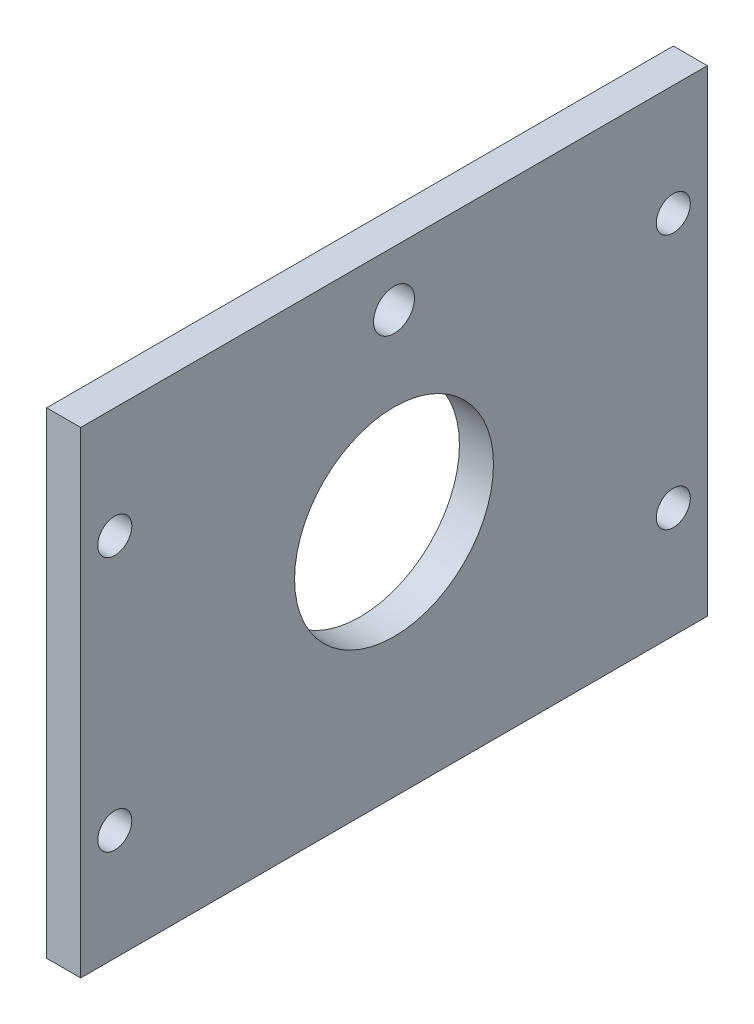
ISO-10303-21;
HEADER;
FILE_DESCRIPTION(('STEP AP214'),'2;1');
FILE_NAME('part.step','',(''),(''),'','','');
FILE_SCHEMA(('AUTOMOTIVE_DESIGN { 1 0 10303 214 1 1 1 1 }'));
ENDSEC;
DATA;
#1=APPLICATION_CONTEXT('core data for automotive mechanical design processes');
#2=APPLICATION_PROTOCOL_DEFINITION('international standard','automotive_design',2000,#1);
#3=PRODUCT_CONTEXT('',#1,'mechanical');
#4=PRODUCT('Part','Part','',(#3));
#5=PRODUCT_RELATED_PRODUCT_CATEGORY('part','',(#4));
#6=PRODUCT_DEFINITION_FORMATION('','',#4);
#7=PRODUCT_DEFINITION_CONTEXT('part definition',#1,'design');
#8=PRODUCT_DEFINITION('design','',#6,#7);
#9=PRODUCT_DEFINITION_SHAPE('','',#8);
#10=(LENGTH_UNIT() NAMED_UNIT(*) SI_UNIT(.MILLI.,.METRE.));
#11=(NAMED_UNIT(*) PLANE_ANGLE_UNIT() SI_UNIT($,.RADIAN.));
#12=(NAMED_UNIT(*) SI_UNIT($,.STERADIAN.) SOLID_ANGLE_UNIT());
#13=UNCERTAINTY_MEASURE_WITH_UNIT(LENGTH_MEASURE(1.E-05),#10,'distance_accuracy_value','');
#14=(GEOMETRIC_REPRESENTATION_CONTEXT(3) GLOBAL_UNCERTAINTY_ASSIGNED_CONTEXT((#13)) GLOBAL_UNIT_ASSIGNED_CONTEXT((#10,
#11,#12)) REPRESENTATION_CONTEXT('',''));
#15=CARTESIAN_POINT('',(0.,0.,0.));
#16=DIRECTION('',(0.,0.,1.));
#17=DIRECTION('',(1.,0.,0.));
#18=AXIS2_PLACEMENT_3D('',#15,#16,#17);
#19=CARTESIAN_POINT('',(5.,0.,0.));
#20=DIRECTION('',(1.,0.,0.));
#21=DIRECTION('',(0.,0.,-1.));
#22=AXIS2_PLACEMENT_3D('',#19,#20,#21);
#23=PLANE('',#22);
#24=CARTESIAN_POINT('',(5.,-8.05947805704662,-45.9999999999998));
#25=DIRECTION('',(-1.,0.,0.));
#26=DIRECTION('',(0.,0.,1.));
#27=AXIS2_PLACEMENT_3D('',#24,#25,#26);
#28=CIRCLE('',#27,3.);
#29=CARTESIAN_POINT('',(5.,-8.05947805704662,-42.9999999999998));
#30=VERTEX_POINT('',#29);
#31=EDGE_CURVE('E143',#30,#30,#28,.T.);
#32=ORIENTED_EDGE('',*,*,#31,.T.);
#33=EDGE_LOOP('',(#32));
#34=FACE_BOUND('',#33,.T.);
#35=CARTESIAN_POINT('',(5.,-16.2724458586385,-4.99999999999979));
#36=DIRECTION('',(1.,0.,0.));
#37=DIRECTION('',(0.,0.,-1.));
#38=AXIS2_PLACEMENT_3D('',#35,#36,#37);
#39=CIRCLE('',#38,2.5);
#40=CARTESIAN_POINT('',(5.,-16.2724458586385,-7.49999999999979));
#41=VERTEX_POINT('',#40);
#42=EDGE_CURVE('E125',#41,#41,#39,.T.);
#43=ORIENTED_EDGE('',*,*,#42,.F.);
#44=EDGE_LOOP('',(#43));
#45=FACE_BOUND('',#44,.T.);
#46=CARTESIAN_POINT('',(5.,-53.7275541413603,-86.9999999999995));
#47=DIRECTION('',(1.,0.,0.));
#48=DIRECTION('',(0.,0.,-1.));
#49=AXIS2_PLACEMENT_3D('',#46,#47,#48);
#50=CIRCLE('',#49,2.5);
#51=CARTESIAN_POINT('',(5.,-53.7275541413603,-89.4999999999995));
#52=VERTEX_POINT('',#51);
#53=EDGE_CURVE('E128',#52,#52,#50,.T.);
#54=ORIENTED_EDGE('',*,*,#53,.F.);
#55=EDGE_LOOP('',(#54));
#56=FACE_BOUND('',#55,.T.);
#57=CARTESIAN_POINT('',(5.,-16.2724458586391,-86.9999999999998));
#58=DIRECTION('',(1.,0.,0.));
#59=DIRECTION('',(0.,0.,-1.));
#60=AXIS2_PLACEMENT_3D('',#57,#58,#59);
#61=CIRCLE('',#60,2.50000000000001);
#62=CARTESIAN_POINT('',(5.,-16.2724458586391,-89.4999999999998));
#63=VERTEX_POINT('',#62);
#64=EDGE_CURVE('E131',#63,#63,#61,.T.);
#65=ORIENTED_EDGE('',*,*,#64,.F.);
#66=EDGE_LOOP('',(#65));
#67=FACE_BOUND('',#66,.T.);
#68=CARTESIAN_POINT('',(5.,-53.7275541413597,-4.99999999999953));
#69=DIRECTION('',(1.,0.,0.));
#70=DIRECTION('',(0.,0.,-1.));
#71=AXIS2_PLACEMENT_3D('',#68,#69,#70);
#72=CIRCLE('',#71,2.5);
#73=CARTESIAN_POINT('',(5.,-53.7275541413597,-7.49999999999953));
#74=VERTEX_POINT('',#73);
#75=EDGE_CURVE('E117',#74,#74,#72,.T.);
#76=ORIENTED_EDGE('',*,*,#75,.F.);
#77=EDGE_LOOP('',(#76));
#78=FACE_BOUND('',#77,.T.);
#79=DIRECTION('',(0.,-1.,0.));
#80=VECTOR('',#79,1.);
#81=CARTESIAN_POINT('',(5.,0.,0.));
#82=LINE('',#81,#80);
#83=CARTESIAN_POINT('',(5.,0.,0.));
#84=VERTEX_POINT('',#83);
#85=CARTESIAN_POINT('',(5.,-70.,0.));
#86=VERTEX_POINT('',#85);
#87=EDGE_CURVE('E86',#84,#86,#82,.T.);
#88=ORIENTED_EDGE('',*,*,#87,.T.);
#89=DIRECTION('',(0.,0.,-1.));
#90=VECTOR('',#89,1.);
#91=CARTESIAN_POINT('',(5.,-70.,0.));
#92=LINE('',#91,#90);
#93=CARTESIAN_POINT('',(5.,-70.,-92.));
#94=VERTEX_POINT('',#93);
#95=EDGE_CURVE('E81',#86,#94,#92,.T.);
#96=ORIENTED_EDGE('',*,*,#95,.T.);
#97=DIRECTION('',(0.,1.,0.));
#98=VECTOR('',#97,1.);
#99=CARTESIAN_POINT('',(5.,0.,-92.));
#100=LINE('',#99,#98);
#101=CARTESIAN_POINT('',(5.,0.,-92.));
#102=VERTEX_POINT('',#101);
#103=EDGE_CURVE('E84',#94,#102,#100,.T.);
#104=ORIENTED_EDGE('',*,*,#103,.T.);
#105=DIRECTION('',(0.,0.,1.));
#106=VECTOR('',#105,1.);
#107=CARTESIAN_POINT('',(5.,0.,0.));
#108=LINE('',#107,#106);
#109=EDGE_CURVE('E51',#102,#84,#108,.T.);
#110=ORIENTED_EDGE('',*,*,#109,.T.);
#111=EDGE_LOOP('',(#88,#96,#104,#110));
#112=FACE_BOUND('',#111,.T.);
#113=CARTESIAN_POINT('',(5.,-35.,-46.));
#114=DIRECTION('',(1.,0.,0.));
#115=DIRECTION('',(0.,0.,-1.));
#116=AXIS2_PLACEMENT_3D('',#113,#114,#115);
#117=CIRCLE('',#116,14.6);
#118=CARTESIAN_POINT('',(5.,-35.,-60.6));
#119=VERTEX_POINT('',#118);
#120=EDGE_CURVE('E102',#119,#119,#117,.T.);
#121=ORIENTED_EDGE('',*,*,#120,.F.);
#122=EDGE_LOOP('',(#121));
#123=FACE_BOUND('',#122,.T.);
#124=ADVANCED_FACE('F33',(#34,#45,#56,#67,#78,#112,#123),#23,.T.);
#125=CARTESIAN_POINT('',(0.,0.,0.));
#126=DIRECTION('',(1.,0.,0.));
#127=DIRECTION('',(0.,0.,-1.));
#128=AXIS2_PLACEMENT_3D('',#125,#126,#127);
#129=PLANE('',#128);
#130=CARTESIAN_POINT('',(0.,-8.05947805704662,-45.9999999999998));
#131=DIRECTION('',(1.,0.,0.));
#132=DIRECTION('',(0.,0.,-1.));
#133=AXIS2_PLACEMENT_3D('',#130,#131,#132);
#134=CIRCLE('',#133,3.);
#135=CARTESIAN_POINT('',(0.,-8.05947805704662,-48.9999999999999));
#136=VERTEX_POINT('',#135);
#137=EDGE_CURVE('E37',#136,#136,#134,.T.);
#138=ORIENTED_EDGE('',*,*,#137,.T.);
#139=EDGE_LOOP('',(#138));
#140=FACE_BOUND('',#139,.T.);
#141=CARTESIAN_POINT('',(0.,-16.2724458586385,-4.99999999999979));
#142=DIRECTION('',(1.,0.,0.));
#143=DIRECTION('',(0.,0.,-1.));
#144=AXIS2_PLACEMENT_3D('',#141,#142,#143);
#145=CIRCLE('',#144,2.5);
#146=CARTESIAN_POINT('',(0.,-16.2724458586385,-7.49999999999979));
#147=VERTEX_POINT('',#146);
#148=EDGE_CURVE('E134',#147,#147,#145,.T.);
#149=ORIENTED_EDGE('',*,*,#148,.T.);
#150=EDGE_LOOP('',(#149));
#151=FACE_BOUND('',#150,.T.);
#152=CARTESIAN_POINT('',(0.,-53.7275541413603,-86.9999999999995));
#153=DIRECTION('',(1.,0.,0.));
#154=DIRECTION('',(0.,0.,-1.));
#155=AXIS2_PLACEMENT_3D('',#152,#153,#154);
#156=CIRCLE('',#155,2.5);
#157=CARTESIAN_POINT('',(0.,-53.7275541413603,-89.4999999999995));
#158=VERTEX_POINT('',#157);
#159=EDGE_CURVE('E138',#158,#158,#156,.T.);
#160=ORIENTED_EDGE('',*,*,#159,.T.);
#161=EDGE_LOOP('',(#160));
#162=FACE_BOUND('',#161,.T.);
#163=CARTESIAN_POINT('',(0.,-16.2724458586391,-86.9999999999998));
#164=DIRECTION('',(1.,0.,0.));
#165=DIRECTION('',(0.,0.,-1.));
#166=AXIS2_PLACEMENT_3D('',#163,#164,#165);
#167=CIRCLE('',#166,2.50000000000001);
#168=CARTESIAN_POINT('',(0.,-16.2724458586391,-89.4999999999998));
#169=VERTEX_POINT('',#168);
#170=EDGE_CURVE('E135',#169,#169,#167,.T.);
#171=ORIENTED_EDGE('',*,*,#170,.T.);
#172=EDGE_LOOP('',(#171));
#173=FACE_BOUND('',#172,.T.);
#174=CARTESIAN_POINT('',(0.,-53.7275541413597,-4.99999999999953));
#175=DIRECTION('',(1.,0.,0.));
#176=DIRECTION('',(0.,0.,-1.));
#177=AXIS2_PLACEMENT_3D('',#174,#175,#176);
#178=CIRCLE('',#177,2.5);
#179=CARTESIAN_POINT('',(0.,-53.7275541413597,-7.49999999999953));
#180=VERTEX_POINT('',#179);
#181=EDGE_CURVE('E122',#180,#180,#178,.T.);
#182=ORIENTED_EDGE('',*,*,#181,.T.);
#183=EDGE_LOOP('',(#182));
#184=FACE_BOUND('',#183,.T.);
#185=DIRECTION('',(0.,-1.,0.));
#186=VECTOR('',#185,1.);
#187=CARTESIAN_POINT('',(0.,0.,0.));
#188=LINE('',#187,#186);
#189=CARTESIAN_POINT('',(0.,0.,0.));
#190=VERTEX_POINT('',#189);
#191=CARTESIAN_POINT('',(0.,-70.,0.));
#192=VERTEX_POINT('',#191);
#193=EDGE_CURVE('E99',#190,#192,#188,.T.);
#194=ORIENTED_EDGE('',*,*,#193,.F.);
#195=DIRECTION('',(0.,0.,1.));
#196=VECTOR('',#195,1.);
#197=CARTESIAN_POINT('',(0.,0.,0.));
#198=LINE('',#197,#196);
#199=CARTESIAN_POINT('',(0.,0.,-92.));
#200=VERTEX_POINT('',#199);
#201=EDGE_CURVE('E74',#200,#190,#198,.T.);
#202=ORIENTED_EDGE('',*,*,#201,.F.);
#203=DIRECTION('',(0.,1.,0.));
#204=VECTOR('',#203,1.);
#205=CARTESIAN_POINT('',(0.,0.,-92.));
#206=LINE('',#205,#204);
#207=CARTESIAN_POINT('',(0.,-70.,-92.));
#208=VERTEX_POINT('',#207);
#209=EDGE_CURVE('E68',#208,#200,#206,.T.);
#210=ORIENTED_EDGE('',*,*,#209,.F.);
#211=DIRECTION('',(0.,0.,-1.));
#212=VECTOR('',#211,1.);
#213=CARTESIAN_POINT('',(0.,-70.,0.));
#214=LINE('',#213,#212);
#215=EDGE_CURVE('E90',#192,#208,#214,.T.);
#216=ORIENTED_EDGE('',*,*,#215,.F.);
#217=EDGE_LOOP('',(#194,#202,#210,#216));
#218=FACE_BOUND('',#217,.T.);
#219=CARTESIAN_POINT('',(0.,-35.,-46.));
#220=DIRECTION('',(1.,0.,0.));
#221=DIRECTION('',(0.,0.,-1.));
#222=AXIS2_PLACEMENT_3D('',#219,#220,#221);
#223=CIRCLE('',#222,14.6);
#224=CARTESIAN_POINT('',(0.,-35.,-60.6));
#225=VERTEX_POINT('',#224);
#226=EDGE_CURVE('E114',#225,#225,#223,.T.);
#227=ORIENTED_EDGE('',*,*,#226,.T.);
#228=EDGE_LOOP('',(#227));
#229=FACE_BOUND('',#228,.T.);
#230=ADVANCED_FACE('F110',(#140,#151,#162,#173,#184,#218,#229),#129,.F.);
#231=CARTESIAN_POINT('',(5.,0.,0.));
#232=DIRECTION('',(0.,0.,-1.));
#233=DIRECTION('',(0.,1.,0.));
#234=AXIS2_PLACEMENT_3D('',#231,#232,#233);
#235=PLANE('',#234);
#236=ORIENTED_EDGE('',*,*,#193,.T.);
#237=DIRECTION('',(-1.,0.,0.));
#238=VECTOR('',#237,1.);
#239=CARTESIAN_POINT('',(5.,-70.,0.));
#240=LINE('',#239,#238);
#241=EDGE_CURVE('E11',#86,#192,#240,.T.);
#242=ORIENTED_EDGE('',*,*,#241,.F.);
#243=ORIENTED_EDGE('',*,*,#87,.F.);
#244=DIRECTION('',(-1.,0.,0.));
#245=VECTOR('',#244,1.);
#246=CARTESIAN_POINT('',(5.,0.,0.));
#247=LINE('',#246,#245);
#248=EDGE_CURVE('E95',#84,#190,#247,.T.);
#249=ORIENTED_EDGE('',*,*,#248,.T.);
#250=EDGE_LOOP('',(#236,#242,#243,#249));
#251=FACE_BOUND('',#250,.T.);
#252=ADVANCED_FACE('F35',(#251),#235,.F.);
#253=CARTESIAN_POINT('',(5.,-70.,0.));
#254=DIRECTION('',(0.,1.,0.));
#255=DIRECTION('',(0.,0.,1.));
#256=AXIS2_PLACEMENT_3D('',#253,#254,#255);
#257=PLANE('',#256);
#258=ORIENTED_EDGE('',*,*,#215,.T.);
#259=DIRECTION('',(-1.,0.,0.));
#260=VECTOR('',#259,1.);
#261=CARTESIAN_POINT('',(5.,-70.,-92.));
#262=LINE('',#261,#260);
#263=EDGE_CURVE('E43',#94,#208,#262,.T.);
#264=ORIENTED_EDGE('',*,*,#263,.F.);
#265=ORIENTED_EDGE('',*,*,#95,.F.);
#266=ORIENTED_EDGE('',*,*,#241,.T.);
#267=EDGE_LOOP('',(#258,#264,#265,#266));
#268=FACE_BOUND('',#267,.T.);
#269=ADVANCED_FACE('F89',(#268),#257,.F.);
#270=CARTESIAN_POINT('',(5.,0.,-92.));
#271=DIRECTION('',(0.,0.,1.));
#272=DIRECTION('',(0.,-1.,0.));
#273=AXIS2_PLACEMENT_3D('',#270,#271,#272);
#274=PLANE('',#273);
#275=ORIENTED_EDGE('',*,*,#209,.T.);
#276=DIRECTION('',(-1.,0.,0.));
#277=VECTOR('',#276,1.);
#278=CARTESIAN_POINT('',(5.,0.,-92.));
#279=LINE('',#278,#277);
#280=EDGE_CURVE('E91',#102,#200,#279,.T.);
#281=ORIENTED_EDGE('',*,*,#280,.F.);
#282=ORIENTED_EDGE('',*,*,#103,.F.);
#283=ORIENTED_EDGE('',*,*,#263,.T.);
#284=EDGE_LOOP('',(#275,#281,#282,#283));
#285=FACE_BOUND('',#284,.T.);
#286=ADVANCED_FACE('F93',(#285),#274,.F.);
#287=CARTESIAN_POINT('',(5.,0.,0.));
#288=DIRECTION('',(0.,-1.,0.));
#289=DIRECTION('',(0.,0.,-1.));
#290=AXIS2_PLACEMENT_3D('',#287,#288,#289);
#291=PLANE('',#290);
#292=ORIENTED_EDGE('',*,*,#201,.T.);
#293=ORIENTED_EDGE('',*,*,#248,.F.);
#294=ORIENTED_EDGE('',*,*,#109,.F.);
#295=ORIENTED_EDGE('',*,*,#280,.T.);
#296=EDGE_LOOP('',(#292,#293,#294,#295));
#297=FACE_BOUND('',#296,.T.);
#298=ADVANCED_FACE('F107',(#297),#291,.F.);
#299=CARTESIAN_POINT('',(5.,-35.,-46.));
#300=DIRECTION('',(-1.,0.,0.));
#301=DIRECTION('',(0.,0.,1.));
#302=AXIS2_PLACEMENT_3D('',#299,#300,#301);
#303=CYLINDRICAL_SURFACE('',#302,14.6);
#304=ORIENTED_EDGE('',*,*,#120,.T.);
#305=EDGE_LOOP('',(#304));
#306=FACE_BOUND('',#305,.T.);
#307=ORIENTED_EDGE('',*,*,#226,.F.);
#308=EDGE_LOOP('',(#307));
#309=FACE_BOUND('',#308,.T.);
#310=ADVANCED_FACE('F172',(#306,#309),#303,.F.);
#311=CARTESIAN_POINT('',(0.,-53.7275541413597,-4.99999999999953));
#312=DIRECTION('',(1.,0.,0.));
#313=DIRECTION('',(0.,0.,-1.));
#314=AXIS2_PLACEMENT_3D('',#311,#312,#313);
#315=CYLINDRICAL_SURFACE('',#314,2.5);
#316=ORIENTED_EDGE('',*,*,#75,.T.);
#317=EDGE_LOOP('',(#316));
#318=FACE_BOUND('',#317,.T.);
#319=ORIENTED_EDGE('',*,*,#181,.F.);
#320=EDGE_LOOP('',(#319));
#321=FACE_BOUND('',#320,.T.);
#322=ADVANCED_FACE('F219',(#318,#321),#315,.F.);
#323=CARTESIAN_POINT('',(0.,-16.2724458586391,-86.9999999999998));
#324=DIRECTION('',(1.,0.,0.));
#325=DIRECTION('',(0.,0.,-1.));
#326=AXIS2_PLACEMENT_3D('',#323,#324,#325);
#327=CYLINDRICAL_SURFACE('',#326,2.50000000000001);
#328=ORIENTED_EDGE('',*,*,#64,.T.);
#329=EDGE_LOOP('',(#328));
#330=FACE_BOUND('',#329,.T.);
#331=ORIENTED_EDGE('',*,*,#170,.F.);
#332=EDGE_LOOP('',(#331));
#333=FACE_BOUND('',#332,.T.);
#334=ADVANCED_FACE('F210',(#330,#333),#327,.F.);
#335=CARTESIAN_POINT('',(0.,-53.7275541413603,-86.9999999999995));
#336=DIRECTION('',(1.,0.,0.));
#337=DIRECTION('',(0.,0.,-1.));
#338=AXIS2_PLACEMENT_3D('',#335,#336,#337);
#339=CYLINDRICAL_SURFACE('',#338,2.5);
#340=ORIENTED_EDGE('',*,*,#53,.T.);
#341=EDGE_LOOP('',(#340));
#342=FACE_BOUND('',#341,.T.);
#343=ORIENTED_EDGE('',*,*,#159,.F.);
#344=EDGE_LOOP('',(#343));
#345=FACE_BOUND('',#344,.T.);
#346=ADVANCED_FACE('F160',(#342,#345),#339,.F.);
#347=CARTESIAN_POINT('',(0.,-16.2724458586385,-4.99999999999979));
#348=DIRECTION('',(1.,0.,0.));
#349=DIRECTION('',(0.,0.,-1.));
#350=AXIS2_PLACEMENT_3D('',#347,#348,#349);
#351=CYLINDRICAL_SURFACE('',#350,2.5);
#352=ORIENTED_EDGE('',*,*,#42,.T.);
#353=EDGE_LOOP('',(#352));
#354=FACE_BOUND('',#353,.T.);
#355=ORIENTED_EDGE('',*,*,#148,.F.);
#356=EDGE_LOOP('',(#355));
#357=FACE_BOUND('',#356,.T.);
#358=ADVANCED_FACE('F154',(#354,#357),#351,.F.);
#359=CARTESIAN_POINT('',(5.,-8.05947805704662,-45.9999999999998));
#360=DIRECTION('',(-1.,0.,0.));
#361=DIRECTION('',(0.,0.,1.));
#362=AXIS2_PLACEMENT_3D('',#359,#360,#361);
#363=CYLINDRICAL_SURFACE('',#362,3.);
#364=ORIENTED_EDGE('',*,*,#31,.F.);
#365=EDGE_LOOP('',(#364));
#366=FACE_BOUND('',#365,.T.);
#367=ORIENTED_EDGE('',*,*,#137,.F.);
#368=EDGE_LOOP('',(#367));
#369=FACE_BOUND('',#368,.T.);
#370=ADVANCED_FACE('F152',(#366,#369),#363,.F.);
#371=CLOSED_SHELL('',(#124,#230,#252,#269,#286,#298,#310,#322,#334,#346,#358,#370));
#372=MANIFOLD_SOLID_BREP('B2',#371);
#373=ADVANCED_BREP_SHAPE_REPRESENTATION('',(#18,#372),#14);
#374=SHAPE_DEFINITION_REPRESENTATION(#9,#373);
ENDSEC;
END-ISO-10303-21;
